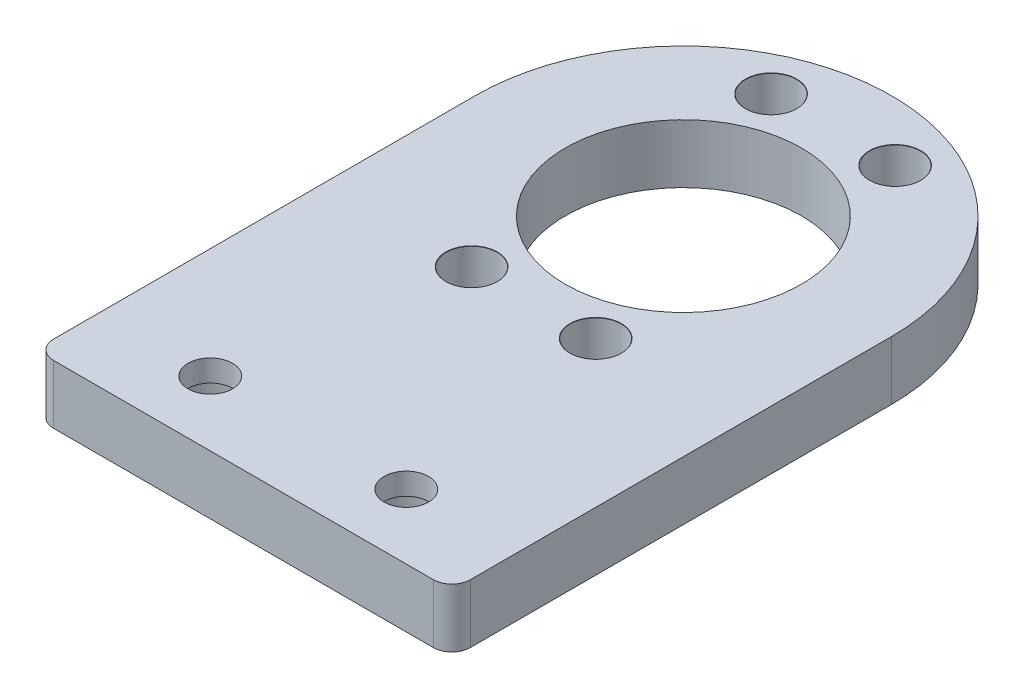
ISO-10303-21;
HEADER;
FILE_DESCRIPTION(('STEP AP214'),'2;1');
FILE_NAME('part.step','',(''),(''),'','','');
FILE_SCHEMA(('AUTOMOTIVE_DESIGN { 1 0 10303 214 1 1 1 1 }'));
ENDSEC;
DATA;
#1=APPLICATION_CONTEXT('core data for automotive mechanical design processes');
#2=APPLICATION_PROTOCOL_DEFINITION('international standard','automotive_design',2000,#1);
#3=PRODUCT_CONTEXT('',#1,'mechanical');
#4=PRODUCT('Part','Part','',(#3));
#5=PRODUCT_RELATED_PRODUCT_CATEGORY('part','',(#4));
#6=PRODUCT_DEFINITION_FORMATION('','',#4);
#7=PRODUCT_DEFINITION_CONTEXT('part definition',#1,'design');
#8=PRODUCT_DEFINITION('design','',#6,#7);
#9=PRODUCT_DEFINITION_SHAPE('','',#8);
#10=(LENGTH_UNIT() NAMED_UNIT(*) SI_UNIT(.MILLI.,.METRE.));
#11=(NAMED_UNIT(*) PLANE_ANGLE_UNIT() SI_UNIT($,.RADIAN.));
#12=(NAMED_UNIT(*) SI_UNIT($,.STERADIAN.) SOLID_ANGLE_UNIT());
#13=UNCERTAINTY_MEASURE_WITH_UNIT(LENGTH_MEASURE(1.E-05),#10,'distance_accuracy_value','');
#14=(GEOMETRIC_REPRESENTATION_CONTEXT(3) GLOBAL_UNCERTAINTY_ASSIGNED_CONTEXT((#13)) GLOBAL_UNIT_ASSIGNED_CONTEXT((#10,
#11,#12)) REPRESENTATION_CONTEXT('',''));
#15=CARTESIAN_POINT('',(0.,0.,0.));
#16=DIRECTION('',(0.,0.,1.));
#17=DIRECTION('',(1.,0.,0.));
#18=AXIS2_PLACEMENT_3D('',#15,#16,#17);
#19=CARTESIAN_POINT('',(0.,6.35,0.));
#20=DIRECTION('',(0.,-1.,0.));
#21=DIRECTION('',(0.,0.,-1.));
#22=AXIS2_PLACEMENT_3D('',#19,#20,#21);
#23=CYLINDRICAL_SURFACE('',#22,22.5);
#24=CARTESIAN_POINT('',(0.,0.,0.));
#25=DIRECTION('',(0.,1.,0.));
#26=DIRECTION('',(0.,0.,1.));
#27=AXIS2_PLACEMENT_3D('',#24,#25,#26);
#28=CIRCLE('',#27,22.5);
#29=CARTESIAN_POINT('',(22.5,0.,-3.34374024839517E-07));
#30=VERTEX_POINT('',#29);
#31=CARTESIAN_POINT('',(-22.5,0.,-3.3437402059358E-07));
#32=VERTEX_POINT('',#31);
#33=EDGE_CURVE('E113',#30,#32,#28,.T.);
#34=ORIENTED_EDGE('',*,*,#33,.T.);
#35=DIRECTION('',(0.,-1.,0.));
#36=VECTOR('',#35,1.);
#37=CARTESIAN_POINT('',(-22.5,6.35,-3.3437402059358E-07));
#38=LINE('',#37,#36);
#39=CARTESIAN_POINT('',(-22.5,6.35,-3.3437402059358E-07));
#40=VERTEX_POINT('',#39);
#41=EDGE_CURVE('E98',#40,#32,#38,.T.);
#42=ORIENTED_EDGE('',*,*,#41,.F.);
#43=CARTESIAN_POINT('',(0.,6.35,0.));
#44=DIRECTION('',(0.,1.,0.));
#45=DIRECTION('',(0.,0.,1.));
#46=AXIS2_PLACEMENT_3D('',#43,#44,#45);
#47=CIRCLE('',#46,22.5);
#48=CARTESIAN_POINT('',(22.5,6.35,-3.34374024839517E-07));
#49=VERTEX_POINT('',#48);
#50=EDGE_CURVE('E102',#49,#40,#47,.T.);
#51=ORIENTED_EDGE('',*,*,#50,.F.);
#52=DIRECTION('',(0.,-1.,0.));
#53=VECTOR('',#52,1.);
#54=CARTESIAN_POINT('',(22.5,6.35,-3.34374024839517E-07));
#55=LINE('',#54,#53);
#56=EDGE_CURVE('E115',#49,#30,#55,.T.);
#57=ORIENTED_EDGE('',*,*,#56,.T.);
#58=EDGE_LOOP('',(#34,#42,#51,#57));
#59=FACE_BOUND('',#58,.T.);
#60=ADVANCED_FACE('F41',(#59),#23,.T.);
#61=CARTESIAN_POINT('',(-22.5,6.35,47.5));
#62=DIRECTION('',(1.,0.,0.));
#63=DIRECTION('',(0.,0.,-1.));
#64=AXIS2_PLACEMENT_3D('',#61,#62,#63);
#65=PLANE('',#64);
#66=DIRECTION('',(0.,0.,1.));
#67=VECTOR('',#66,1.);
#68=CARTESIAN_POINT('',(-22.5,0.,47.5));
#69=LINE('',#68,#67);
#70=CARTESIAN_POINT('',(-22.5,0.,45.5));
#71=VERTEX_POINT('',#70);
#72=EDGE_CURVE('E141',#32,#71,#69,.T.);
#73=ORIENTED_EDGE('',*,*,#72,.T.);
#74=DIRECTION('',(0.,-1.,0.));
#75=VECTOR('',#74,1.);
#76=CARTESIAN_POINT('',(-22.5,6.35,45.5));
#77=LINE('',#76,#75);
#78=CARTESIAN_POINT('',(-22.5,6.35,45.5));
#79=VERTEX_POINT('',#78);
#80=EDGE_CURVE('E64',#71,#79,#77,.F.);
#81=ORIENTED_EDGE('',*,*,#80,.T.);
#82=DIRECTION('',(0.,0.,1.));
#83=VECTOR('',#82,1.);
#84=CARTESIAN_POINT('',(-22.5,6.35,47.5));
#85=LINE('',#84,#83);
#86=EDGE_CURVE('E94',#40,#79,#85,.T.);
#87=ORIENTED_EDGE('',*,*,#86,.F.);
#88=ORIENTED_EDGE('',*,*,#41,.T.);
#89=EDGE_LOOP('',(#73,#81,#87,#88));
#90=FACE_BOUND('',#89,.T.);
#91=ADVANCED_FACE('F96',(#90),#65,.F.);
#92=CARTESIAN_POINT('',(-22.5,6.35,47.5));
#93=DIRECTION('',(0.,0.,-1.));
#94=DIRECTION('',(-1.,0.,0.));
#95=AXIS2_PLACEMENT_3D('',#92,#93,#94);
#96=PLANE('',#95);
#97=DIRECTION('',(1.,0.,0.));
#98=VECTOR('',#97,1.);
#99=CARTESIAN_POINT('',(-22.5,6.35,47.5));
#100=LINE('',#99,#98);
#101=CARTESIAN_POINT('',(-20.5,6.35,47.5));
#102=VERTEX_POINT('',#101);
#103=CARTESIAN_POINT('',(20.5,6.35,47.5));
#104=VERTEX_POINT('',#103);
#105=EDGE_CURVE('E101',#102,#104,#100,.T.);
#106=ORIENTED_EDGE('',*,*,#105,.F.);
#107=DIRECTION('',(0.,-1.,0.));
#108=VECTOR('',#107,1.);
#109=CARTESIAN_POINT('',(-20.5,6.35,47.5));
#110=LINE('',#109,#108);
#111=CARTESIAN_POINT('',(-20.5,0.,47.5));
#112=VERTEX_POINT('',#111);
#113=EDGE_CURVE('E117',#102,#112,#110,.T.);
#114=ORIENTED_EDGE('',*,*,#113,.T.);
#115=DIRECTION('',(1.,0.,0.));
#116=VECTOR('',#115,1.);
#117=CARTESIAN_POINT('',(-22.5,0.,47.5));
#118=LINE('',#117,#116);
#119=CARTESIAN_POINT('',(20.5,0.,47.5));
#120=VERTEX_POINT('',#119);
#121=EDGE_CURVE('E142',#112,#120,#118,.T.);
#122=ORIENTED_EDGE('',*,*,#121,.T.);
#123=DIRECTION('',(0.,-1.,0.));
#124=VECTOR('',#123,1.);
#125=CARTESIAN_POINT('',(20.5,6.35,47.5));
#126=LINE('',#125,#124);
#127=EDGE_CURVE('E114',#120,#104,#126,.F.);
#128=ORIENTED_EDGE('',*,*,#127,.T.);
#129=EDGE_LOOP('',(#106,#114,#122,#128));
#130=FACE_BOUND('',#129,.T.);
#131=ADVANCED_FACE('F133',(#130),#96,.F.);
#132=CARTESIAN_POINT('',(22.5,6.35,47.5));
#133=DIRECTION('',(-1.,0.,0.));
#134=DIRECTION('',(0.,0.,1.));
#135=AXIS2_PLACEMENT_3D('',#132,#133,#134);
#136=PLANE('',#135);
#137=DIRECTION('',(0.,0.,-1.));
#138=VECTOR('',#137,1.);
#139=CARTESIAN_POINT('',(22.5,6.35,47.5));
#140=LINE('',#139,#138);
#141=CARTESIAN_POINT('',(22.5,6.35,45.5));
#142=VERTEX_POINT('',#141);
#143=EDGE_CURVE('E106',#142,#49,#140,.T.);
#144=ORIENTED_EDGE('',*,*,#143,.F.);
#145=DIRECTION('',(0.,-1.,0.));
#146=VECTOR('',#145,1.);
#147=CARTESIAN_POINT('',(22.5,6.35,45.5));
#148=LINE('',#147,#146);
#149=CARTESIAN_POINT('',(22.5,0.,45.5));
#150=VERTEX_POINT('',#149);
#151=EDGE_CURVE('E11',#142,#150,#148,.T.);
#152=ORIENTED_EDGE('',*,*,#151,.T.);
#153=DIRECTION('',(0.,0.,-1.));
#154=VECTOR('',#153,1.);
#155=CARTESIAN_POINT('',(22.5,0.,47.5));
#156=LINE('',#155,#154);
#157=EDGE_CURVE('E110',#150,#30,#156,.T.);
#158=ORIENTED_EDGE('',*,*,#157,.T.);
#159=ORIENTED_EDGE('',*,*,#56,.F.);
#160=EDGE_LOOP('',(#144,#152,#158,#159));
#161=FACE_BOUND('',#160,.T.);
#162=ADVANCED_FACE('F150',(#161),#136,.F.);
#163=CARTESIAN_POINT('',(0.,6.35,0.));
#164=DIRECTION('',(0.,1.,0.));
#165=DIRECTION('',(0.,0.,1.));
#166=AXIS2_PLACEMENT_3D('',#163,#164,#165);
#167=PLANE('',#166);
#168=CARTESIAN_POINT('',(10.5847856494314,6.35,40.5));
#169=DIRECTION('',(0.,-1.,0.));
#170=DIRECTION('',(0.,0.,-1.));
#171=AXIS2_PLACEMENT_3D('',#168,#169,#170);
#172=CIRCLE('',#171,2.4);
#173=CARTESIAN_POINT('',(10.5847856494314,6.35,38.1));
#174=VERTEX_POINT('',#173);
#175=EDGE_CURVE('E259',#174,#174,#172,.T.);
#176=ORIENTED_EDGE('',*,*,#175,.T.);
#177=EDGE_LOOP('',(#176));
#178=FACE_BOUND('',#177,.T.);
#179=CARTESIAN_POINT('',(-10.5847856494314,6.35,40.5));
#180=DIRECTION('',(0.,-1.,0.));
#181=DIRECTION('',(0.,0.,-1.));
#182=AXIS2_PLACEMENT_3D('',#179,#180,#181);
#183=CIRCLE('',#182,2.4);
#184=CARTESIAN_POINT('',(-10.5847856494314,6.35,38.1));
#185=VERTEX_POINT('',#184);
#186=EDGE_CURVE('E274',#185,#185,#183,.T.);
#187=ORIENTED_EDGE('',*,*,#186,.T.);
#188=EDGE_LOOP('',(#187));
#189=FACE_BOUND('',#188,.T.);
#190=CARTESIAN_POINT('',(0.,6.35,0.));
#191=DIRECTION('',(0.,1.,0.));
#192=DIRECTION('',(0.,0.,1.));
#193=AXIS2_PLACEMENT_3D('',#190,#191,#192);
#194=CIRCLE('',#193,12.75);
#195=CARTESIAN_POINT('',(0.,6.35,12.75));
#196=VERTEX_POINT('',#195);
#197=EDGE_CURVE('E277',#196,#196,#194,.T.);
#198=ORIENTED_EDGE('',*,*,#197,.F.);
#199=EDGE_LOOP('',(#198));
#200=FACE_BOUND('',#199,.T.);
#201=CARTESIAN_POINT('',(-6.69696006638907,6.35,16.1678918189475));
#202=DIRECTION('',(0.,1.,0.));
#203=DIRECTION('',(0.,0.,1.));
#204=AXIS2_PLACEMENT_3D('',#201,#202,#203);
#205=CIRCLE('',#204,2.775);
#206=CARTESIAN_POINT('',(-6.69696006638907,6.35,18.9428918189475));
#207=VERTEX_POINT('',#206);
#208=EDGE_CURVE('E281',#207,#207,#205,.T.);
#209=ORIENTED_EDGE('',*,*,#208,.F.);
#210=EDGE_LOOP('',(#209));
#211=FACE_BOUND('',#210,.T.);
#212=CARTESIAN_POINT('',(6.69696006638907,6.35,16.1678918189475));
#213=DIRECTION('',(0.,1.,0.));
#214=DIRECTION('',(0.,0.,1.));
#215=AXIS2_PLACEMENT_3D('',#212,#213,#214);
#216=CIRCLE('',#215,2.775);
#217=CARTESIAN_POINT('',(6.69696006638907,6.35,18.9428918189475));
#218=VERTEX_POINT('',#217);
#219=EDGE_CURVE('E292',#218,#218,#216,.T.);
#220=ORIENTED_EDGE('',*,*,#219,.F.);
#221=EDGE_LOOP('',(#220));
#222=FACE_BOUND('',#221,.T.);
#223=CARTESIAN_POINT('',(6.69696006638907,6.35,-16.1678918189475));
#224=DIRECTION('',(0.,1.,0.));
#225=DIRECTION('',(0.,0.,1.));
#226=AXIS2_PLACEMENT_3D('',#223,#224,#225);
#227=CIRCLE('',#226,2.775);
#228=CARTESIAN_POINT('',(6.69696006638907,6.35,-13.3928918189475));
#229=VERTEX_POINT('',#228);
#230=EDGE_CURVE('E301',#229,#229,#227,.T.);
#231=ORIENTED_EDGE('',*,*,#230,.F.);
#232=EDGE_LOOP('',(#231));
#233=FACE_BOUND('',#232,.T.);
#234=CARTESIAN_POINT('',(-6.69696006638907,6.35,-16.1678918189475));
#235=DIRECTION('',(0.,1.,0.));
#236=DIRECTION('',(0.,0.,1.));
#237=AXIS2_PLACEMENT_3D('',#234,#235,#236);
#238=CIRCLE('',#237,2.775);
#239=CARTESIAN_POINT('',(-6.69696006638907,6.35,-13.3928918189475));
#240=VERTEX_POINT('',#239);
#241=EDGE_CURVE('E310',#240,#240,#238,.T.);
#242=ORIENTED_EDGE('',*,*,#241,.F.);
#243=EDGE_LOOP('',(#242));
#244=FACE_BOUND('',#243,.T.);
#245=ORIENTED_EDGE('',*,*,#86,.T.);
#246=CARTESIAN_POINT('',(-20.5,6.35,45.5));
#247=DIRECTION('',(0.,1.,0.));
#248=DIRECTION('',(0.,0.,1.));
#249=AXIS2_PLACEMENT_3D('',#246,#247,#248);
#250=CIRCLE('',#249,2.);
#251=EDGE_CURVE('E49',#79,#102,#250,.T.);
#252=ORIENTED_EDGE('',*,*,#251,.T.);
#253=ORIENTED_EDGE('',*,*,#105,.T.);
#254=CARTESIAN_POINT('',(20.5,6.35,45.5));
#255=DIRECTION('',(0.,1.,0.));
#256=DIRECTION('',(0.,0.,1.));
#257=AXIS2_PLACEMENT_3D('',#254,#255,#256);
#258=CIRCLE('',#257,2.);
#259=EDGE_CURVE('E56',#104,#142,#258,.T.);
#260=ORIENTED_EDGE('',*,*,#259,.T.);
#261=ORIENTED_EDGE('',*,*,#143,.T.);
#262=ORIENTED_EDGE('',*,*,#50,.T.);
#263=EDGE_LOOP('',(#245,#252,#253,#260,#261,#262));
#264=FACE_BOUND('',#263,.T.);
#265=ADVANCED_FACE('F105',(#178,#189,#200,#211,#222,#233,#244,#264),#167,.T.);
#266=CARTESIAN_POINT('',(0.,0.,0.));
#267=DIRECTION('',(0.,1.,0.));
#268=DIRECTION('',(0.,0.,1.));
#269=AXIS2_PLACEMENT_3D('',#266,#267,#268);
#270=PLANE('',#269);
#271=CARTESIAN_POINT('',(10.5847856494314,0.,40.5));
#272=DIRECTION('',(0.,-1.,0.));
#273=DIRECTION('',(0.,0.,-1.));
#274=AXIS2_PLACEMENT_3D('',#271,#272,#273);
#275=CIRCLE('',#274,4.025);
#276=CARTESIAN_POINT('',(10.5847856494314,0.,36.475));
#277=VERTEX_POINT('',#276);
#278=EDGE_CURVE('E249',#277,#277,#275,.T.);
#279=ORIENTED_EDGE('',*,*,#278,.F.);
#280=EDGE_LOOP('',(#279));
#281=FACE_BOUND('',#280,.T.);
#282=CARTESIAN_POINT('',(-10.5847856494314,0.,40.5));
#283=DIRECTION('',(0.,-1.,0.));
#284=DIRECTION('',(0.,0.,-1.));
#285=AXIS2_PLACEMENT_3D('',#282,#283,#284);
#286=CIRCLE('',#285,4.025);
#287=CARTESIAN_POINT('',(-10.5847856494314,0.,36.475));
#288=VERTEX_POINT('',#287);
#289=EDGE_CURVE('E262',#288,#288,#286,.T.);
#290=ORIENTED_EDGE('',*,*,#289,.F.);
#291=EDGE_LOOP('',(#290));
#292=FACE_BOUND('',#291,.T.);
#293=CARTESIAN_POINT('',(0.,0.,0.));
#294=DIRECTION('',(0.,1.,0.));
#295=DIRECTION('',(0.,0.,1.));
#296=AXIS2_PLACEMENT_3D('',#293,#294,#295);
#297=CIRCLE('',#296,12.75);
#298=CARTESIAN_POINT('',(0.,0.,12.75));
#299=VERTEX_POINT('',#298);
#300=EDGE_CURVE('E278',#299,#299,#297,.T.);
#301=ORIENTED_EDGE('',*,*,#300,.T.);
#302=EDGE_LOOP('',(#301));
#303=FACE_BOUND('',#302,.T.);
#304=CARTESIAN_POINT('',(-6.69696006638907,0.,16.1678918189475));
#305=DIRECTION('',(0.,1.,0.));
#306=DIRECTION('',(0.,0.,1.));
#307=AXIS2_PLACEMENT_3D('',#304,#305,#306);
#308=CIRCLE('',#307,2.75);
#309=CARTESIAN_POINT('',(-6.69696006638907,0.,18.9178918189475));
#310=VERTEX_POINT('',#309);
#311=EDGE_CURVE('E289',#310,#310,#308,.T.);
#312=ORIENTED_EDGE('',*,*,#311,.T.);
#313=EDGE_LOOP('',(#312));
#314=FACE_BOUND('',#313,.T.);
#315=CARTESIAN_POINT('',(6.69696006638907,0.,16.1678918189475));
#316=DIRECTION('',(0.,1.,0.));
#317=DIRECTION('',(0.,0.,1.));
#318=AXIS2_PLACEMENT_3D('',#315,#316,#317);
#319=CIRCLE('',#318,2.75);
#320=CARTESIAN_POINT('',(6.69696006638907,0.,18.9178918189475));
#321=VERTEX_POINT('',#320);
#322=EDGE_CURVE('E298',#321,#321,#319,.T.);
#323=ORIENTED_EDGE('',*,*,#322,.T.);
#324=EDGE_LOOP('',(#323));
#325=FACE_BOUND('',#324,.T.);
#326=CARTESIAN_POINT('',(6.69696006638907,0.,-16.1678918189475));
#327=DIRECTION('',(0.,1.,0.));
#328=DIRECTION('',(0.,0.,1.));
#329=AXIS2_PLACEMENT_3D('',#326,#327,#328);
#330=CIRCLE('',#329,2.75);
#331=CARTESIAN_POINT('',(6.69696006638907,0.,-13.4178918189475));
#332=VERTEX_POINT('',#331);
#333=EDGE_CURVE('E307',#332,#332,#330,.T.);
#334=ORIENTED_EDGE('',*,*,#333,.T.);
#335=EDGE_LOOP('',(#334));
#336=FACE_BOUND('',#335,.T.);
#337=CARTESIAN_POINT('',(-6.69696006638907,0.,-16.1678918189475));
#338=DIRECTION('',(0.,1.,0.));
#339=DIRECTION('',(0.,0.,1.));
#340=AXIS2_PLACEMENT_3D('',#337,#338,#339);
#341=CIRCLE('',#340,2.75);
#342=CARTESIAN_POINT('',(-6.69696006638907,0.,-13.4178918189475));
#343=VERTEX_POINT('',#342);
#344=EDGE_CURVE('E145',#343,#343,#341,.T.);
#345=ORIENTED_EDGE('',*,*,#344,.T.);
#346=EDGE_LOOP('',(#345));
#347=FACE_BOUND('',#346,.T.);
#348=ORIENTED_EDGE('',*,*,#121,.F.);
#349=CARTESIAN_POINT('',(-20.5,0.,45.5));
#350=DIRECTION('',(0.,1.,0.));
#351=DIRECTION('',(0.,0.,1.));
#352=AXIS2_PLACEMENT_3D('',#349,#350,#351);
#353=CIRCLE('',#352,2.);
#354=EDGE_CURVE('E126',#112,#71,#353,.F.);
#355=ORIENTED_EDGE('',*,*,#354,.T.);
#356=ORIENTED_EDGE('',*,*,#72,.F.);
#357=ORIENTED_EDGE('',*,*,#33,.F.);
#358=ORIENTED_EDGE('',*,*,#157,.F.);
#359=CARTESIAN_POINT('',(20.5,0.,45.5));
#360=DIRECTION('',(0.,1.,0.));
#361=DIRECTION('',(0.,0.,1.));
#362=AXIS2_PLACEMENT_3D('',#359,#360,#361);
#363=CIRCLE('',#362,2.);
#364=EDGE_CURVE('E124',#150,#120,#363,.F.);
#365=ORIENTED_EDGE('',*,*,#364,.T.);
#366=EDGE_LOOP('',(#348,#355,#356,#357,#358,#365));
#367=FACE_BOUND('',#366,.T.);
#368=ADVANCED_FACE('F140',(#281,#292,#303,#314,#325,#336,#347,#367),#270,.F.);
#369=CARTESIAN_POINT('',(-6.69696006638907,6.35,-16.1678918189475));
#370=DIRECTION('',(0.,1.,0.));
#371=DIRECTION('',(0.,0.,1.));
#372=AXIS2_PLACEMENT_3D('',#369,#370,#371);
#373=CYLINDRICAL_SURFACE('',#372,2.75);
#374=ORIENTED_EDGE('',*,*,#344,.F.);
#375=EDGE_LOOP('',(#374));
#376=FACE_BOUND('',#375,.T.);
#377=CARTESIAN_POINT('',(-6.69696006638907,6.325,-16.1678918189475));
#378=DIRECTION('',(0.,1.,0.));
#379=DIRECTION('',(0.,0.,1.));
#380=AXIS2_PLACEMENT_3D('',#377,#378,#379);
#381=CIRCLE('',#380,2.75);
#382=CARTESIAN_POINT('',(-6.69696006638907,6.325,-13.4178918189475));
#383=VERTEX_POINT('',#382);
#384=EDGE_CURVE('E313',#383,#383,#381,.T.);
#385=ORIENTED_EDGE('',*,*,#384,.T.);
#386=EDGE_LOOP('',(#385));
#387=FACE_BOUND('',#386,.T.);
#388=ADVANCED_FACE('F171',(#376,#387),#373,.F.);
#389=CARTESIAN_POINT('',(-6.69696006638907,6.35,-16.1678918189475));
#390=DIRECTION('',(0.,1.,0.));
#391=DIRECTION('',(0.,0.,1.));
#392=AXIS2_PLACEMENT_3D('',#389,#390,#391);
#393=CONICAL_SURFACE('',#392,2.775,0.785398163397414);
#394=ORIENTED_EDGE('',*,*,#384,.F.);
#395=EDGE_LOOP('',(#394));
#396=FACE_BOUND('',#395,.T.);
#397=ORIENTED_EDGE('',*,*,#241,.T.);
#398=EDGE_LOOP('',(#397));
#399=FACE_BOUND('',#398,.T.);
#400=ADVANCED_FACE('F178',(#396,#399),#393,.F.);
#401=CARTESIAN_POINT('',(6.69696006638907,6.35,-16.1678918189475));
#402=DIRECTION('',(0.,1.,0.));
#403=DIRECTION('',(0.,0.,1.));
#404=AXIS2_PLACEMENT_3D('',#401,#402,#403);
#405=CYLINDRICAL_SURFACE('',#404,2.75);
#406=ORIENTED_EDGE('',*,*,#333,.F.);
#407=EDGE_LOOP('',(#406));
#408=FACE_BOUND('',#407,.T.);
#409=CARTESIAN_POINT('',(6.69696006638907,6.325,-16.1678918189475));
#410=DIRECTION('',(0.,1.,0.));
#411=DIRECTION('',(0.,0.,1.));
#412=AXIS2_PLACEMENT_3D('',#409,#410,#411);
#413=CIRCLE('',#412,2.75);
#414=CARTESIAN_POINT('',(6.69696006638907,6.325,-13.4178918189475));
#415=VERTEX_POINT('',#414);
#416=EDGE_CURVE('E304',#415,#415,#413,.T.);
#417=ORIENTED_EDGE('',*,*,#416,.T.);
#418=EDGE_LOOP('',(#417));
#419=FACE_BOUND('',#418,.T.);
#420=ADVANCED_FACE('F182',(#408,#419),#405,.F.);
#421=CARTESIAN_POINT('',(6.69696006638907,6.35,-16.1678918189475));
#422=DIRECTION('',(0.,1.,0.));
#423=DIRECTION('',(0.,0.,1.));
#424=AXIS2_PLACEMENT_3D('',#421,#422,#423);
#425=CONICAL_SURFACE('',#424,2.775,0.785398163397414);
#426=ORIENTED_EDGE('',*,*,#416,.F.);
#427=EDGE_LOOP('',(#426));
#428=FACE_BOUND('',#427,.T.);
#429=ORIENTED_EDGE('',*,*,#230,.T.);
#430=EDGE_LOOP('',(#429));
#431=FACE_BOUND('',#430,.T.);
#432=ADVANCED_FACE('F186',(#428,#431),#425,.F.);
#433=CARTESIAN_POINT('',(6.69696006638907,6.35,16.1678918189475));
#434=DIRECTION('',(0.,1.,0.));
#435=DIRECTION('',(0.,0.,1.));
#436=AXIS2_PLACEMENT_3D('',#433,#434,#435);
#437=CYLINDRICAL_SURFACE('',#436,2.75);
#438=ORIENTED_EDGE('',*,*,#322,.F.);
#439=EDGE_LOOP('',(#438));
#440=FACE_BOUND('',#439,.T.);
#441=CARTESIAN_POINT('',(6.69696006638907,6.325,16.1678918189475));
#442=DIRECTION('',(0.,1.,0.));
#443=DIRECTION('',(0.,0.,1.));
#444=AXIS2_PLACEMENT_3D('',#441,#442,#443);
#445=CIRCLE('',#444,2.75);
#446=CARTESIAN_POINT('',(6.69696006638907,6.325,18.9178918189475));
#447=VERTEX_POINT('',#446);
#448=EDGE_CURVE('E295',#447,#447,#445,.T.);
#449=ORIENTED_EDGE('',*,*,#448,.T.);
#450=EDGE_LOOP('',(#449));
#451=FACE_BOUND('',#450,.T.);
#452=ADVANCED_FACE('F190',(#440,#451),#437,.F.);
#453=CARTESIAN_POINT('',(6.69696006638907,6.35,16.1678918189475));
#454=DIRECTION('',(0.,1.,0.));
#455=DIRECTION('',(0.,0.,1.));
#456=AXIS2_PLACEMENT_3D('',#453,#454,#455);
#457=CONICAL_SURFACE('',#456,2.775,0.785398163397414);
#458=ORIENTED_EDGE('',*,*,#448,.F.);
#459=EDGE_LOOP('',(#458));
#460=FACE_BOUND('',#459,.T.);
#461=ORIENTED_EDGE('',*,*,#219,.T.);
#462=EDGE_LOOP('',(#461));
#463=FACE_BOUND('',#462,.T.);
#464=ADVANCED_FACE('F194',(#460,#463),#457,.F.);
#465=CARTESIAN_POINT('',(-6.69696006638907,6.35,16.1678918189475));
#466=DIRECTION('',(0.,1.,0.));
#467=DIRECTION('',(0.,0.,1.));
#468=AXIS2_PLACEMENT_3D('',#465,#466,#467);
#469=CYLINDRICAL_SURFACE('',#468,2.75);
#470=ORIENTED_EDGE('',*,*,#311,.F.);
#471=EDGE_LOOP('',(#470));
#472=FACE_BOUND('',#471,.T.);
#473=CARTESIAN_POINT('',(-6.69696006638907,6.325,16.1678918189475));
#474=DIRECTION('',(0.,1.,0.));
#475=DIRECTION('',(0.,0.,1.));
#476=AXIS2_PLACEMENT_3D('',#473,#474,#475);
#477=CIRCLE('',#476,2.75);
#478=CARTESIAN_POINT('',(-6.69696006638907,6.325,18.9178918189475));
#479=VERTEX_POINT('',#478);
#480=EDGE_CURVE('E286',#479,#479,#477,.T.);
#481=ORIENTED_EDGE('',*,*,#480,.T.);
#482=EDGE_LOOP('',(#481));
#483=FACE_BOUND('',#482,.T.);
#484=ADVANCED_FACE('F198',(#472,#483),#469,.F.);
#485=CARTESIAN_POINT('',(-6.69696006638907,6.35,16.1678918189475));
#486=DIRECTION('',(0.,1.,0.));
#487=DIRECTION('',(0.,0.,1.));
#488=AXIS2_PLACEMENT_3D('',#485,#486,#487);
#489=CONICAL_SURFACE('',#488,2.775,0.785398163397414);
#490=ORIENTED_EDGE('',*,*,#480,.F.);
#491=EDGE_LOOP('',(#490));
#492=FACE_BOUND('',#491,.T.);
#493=ORIENTED_EDGE('',*,*,#208,.T.);
#494=EDGE_LOOP('',(#493));
#495=FACE_BOUND('',#494,.T.);
#496=ADVANCED_FACE('F202',(#492,#495),#489,.F.);
#497=CARTESIAN_POINT('',(0.,0.,0.));
#498=DIRECTION('',(0.,1.,0.));
#499=DIRECTION('',(0.,0.,1.));
#500=AXIS2_PLACEMENT_3D('',#497,#498,#499);
#501=CYLINDRICAL_SURFACE('',#500,12.75);
#502=ORIENTED_EDGE('',*,*,#300,.F.);
#503=EDGE_LOOP('',(#502));
#504=FACE_BOUND('',#503,.T.);
#505=ORIENTED_EDGE('',*,*,#197,.T.);
#506=EDGE_LOOP('',(#505));
#507=FACE_BOUND('',#506,.T.);
#508=ADVANCED_FACE('F206',(#504,#507),#501,.F.);
#509=CARTESIAN_POINT('',(-10.5847856494314,0.,40.5));
#510=DIRECTION('',(0.,-1.,0.));
#511=DIRECTION('',(0.,0.,-1.));
#512=AXIS2_PLACEMENT_3D('',#509,#510,#511);
#513=CYLINDRICAL_SURFACE('',#512,2.4);
#514=ORIENTED_EDGE('',*,*,#186,.F.);
#515=EDGE_LOOP('',(#514));
#516=FACE_BOUND('',#515,.T.);
#517=CARTESIAN_POINT('',(-10.5847856494314,4.,40.5));
#518=DIRECTION('',(0.,-1.,0.));
#519=DIRECTION('',(0.,0.,-1.));
#520=AXIS2_PLACEMENT_3D('',#517,#518,#519);
#521=CIRCLE('',#520,2.4);
#522=CARTESIAN_POINT('',(-10.5847856494314,4.,38.1));
#523=VERTEX_POINT('',#522);
#524=EDGE_CURVE('E271',#523,#523,#521,.T.);
#525=ORIENTED_EDGE('',*,*,#524,.T.);
#526=EDGE_LOOP('',(#525));
#527=FACE_BOUND('',#526,.T.);
#528=ADVANCED_FACE('F210',(#516,#527),#513,.F.);
#529=CARTESIAN_POINT('',(-6.58478564943144,4.,40.5));
#530=DIRECTION('',(0.,1.,0.));
#531=DIRECTION('',(0.,0.,1.));
#532=AXIS2_PLACEMENT_3D('',#529,#530,#531);
#533=PLANE('',#532);
#534=ORIENTED_EDGE('',*,*,#524,.F.);
#535=EDGE_LOOP('',(#534));
#536=FACE_BOUND('',#535,.T.);
#537=CARTESIAN_POINT('',(-10.5847856494314,4.,40.5));
#538=DIRECTION('',(0.,-1.,0.));
#539=DIRECTION('',(0.,0.,-1.));
#540=AXIS2_PLACEMENT_3D('',#537,#538,#539);
#541=CIRCLE('',#540,4.);
#542=CARTESIAN_POINT('',(-10.5847856494314,4.,36.5));
#543=VERTEX_POINT('',#542);
#544=EDGE_CURVE('E268',#543,#543,#541,.T.);
#545=ORIENTED_EDGE('',*,*,#544,.T.);
#546=EDGE_LOOP('',(#545));
#547=FACE_BOUND('',#546,.T.);
#548=ADVANCED_FACE('F214',(#536,#547),#533,.F.);
#549=CARTESIAN_POINT('',(-10.5847856494314,0.,40.5));
#550=DIRECTION('',(0.,-1.,0.));
#551=DIRECTION('',(0.,0.,-1.));
#552=AXIS2_PLACEMENT_3D('',#549,#550,#551);
#553=CYLINDRICAL_SURFACE('',#552,4.);
#554=ORIENTED_EDGE('',*,*,#544,.F.);
#555=EDGE_LOOP('',(#554));
#556=FACE_BOUND('',#555,.T.);
#557=CARTESIAN_POINT('',(-10.5847856494314,0.0250000000000018,40.5));
#558=DIRECTION('',(0.,-1.,0.));
#559=DIRECTION('',(0.,0.,-1.));
#560=AXIS2_PLACEMENT_3D('',#557,#558,#559);
#561=CIRCLE('',#560,4.);
#562=CARTESIAN_POINT('',(-10.5847856494314,0.0250000000000018,36.5));
#563=VERTEX_POINT('',#562);
#564=EDGE_CURVE('E265',#563,#563,#561,.T.);
#565=ORIENTED_EDGE('',*,*,#564,.T.);
#566=EDGE_LOOP('',(#565));
#567=FACE_BOUND('',#566,.T.);
#568=ADVANCED_FACE('F218',(#556,#567),#553,.F.);
#569=CARTESIAN_POINT('',(-10.5847856494314,0.,40.5));
#570=DIRECTION('',(0.,-1.,0.));
#571=DIRECTION('',(0.,0.,-1.));
#572=AXIS2_PLACEMENT_3D('',#569,#570,#571);
#573=CONICAL_SURFACE('',#572,4.025,0.785398163397444);
#574=ORIENTED_EDGE('',*,*,#564,.F.);
#575=EDGE_LOOP('',(#574));
#576=FACE_BOUND('',#575,.T.);
#577=ORIENTED_EDGE('',*,*,#289,.T.);
#578=EDGE_LOOP('',(#577));
#579=FACE_BOUND('',#578,.T.);
#580=ADVANCED_FACE('F222',(#576,#579),#573,.F.);
#581=CARTESIAN_POINT('',(10.5847856494314,0.,40.5));
#582=DIRECTION('',(0.,-1.,0.));
#583=DIRECTION('',(0.,0.,-1.));
#584=AXIS2_PLACEMENT_3D('',#581,#582,#583);
#585=CYLINDRICAL_SURFACE('',#584,2.4);
#586=ORIENTED_EDGE('',*,*,#175,.F.);
#587=EDGE_LOOP('',(#586));
#588=FACE_BOUND('',#587,.T.);
#589=CARTESIAN_POINT('',(10.5847856494314,4.,40.5));
#590=DIRECTION('',(0.,-1.,0.));
#591=DIRECTION('',(0.,0.,-1.));
#592=AXIS2_PLACEMENT_3D('',#589,#590,#591);
#593=CIRCLE('',#592,2.4);
#594=CARTESIAN_POINT('',(10.5847856494314,4.,38.1));
#595=VERTEX_POINT('',#594);
#596=EDGE_CURVE('E256',#595,#595,#593,.T.);
#597=ORIENTED_EDGE('',*,*,#596,.T.);
#598=EDGE_LOOP('',(#597));
#599=FACE_BOUND('',#598,.T.);
#600=ADVANCED_FACE('F226',(#588,#599),#585,.F.);
#601=CARTESIAN_POINT('',(14.5847856494314,4.,40.5));
#602=DIRECTION('',(0.,1.,0.));
#603=DIRECTION('',(0.,0.,1.));
#604=AXIS2_PLACEMENT_3D('',#601,#602,#603);
#605=PLANE('',#604);
#606=ORIENTED_EDGE('',*,*,#596,.F.);
#607=EDGE_LOOP('',(#606));
#608=FACE_BOUND('',#607,.T.);
#609=CARTESIAN_POINT('',(10.5847856494314,4.,40.5));
#610=DIRECTION('',(0.,-1.,0.));
#611=DIRECTION('',(0.,0.,-1.));
#612=AXIS2_PLACEMENT_3D('',#609,#610,#611);
#613=CIRCLE('',#612,4.);
#614=CARTESIAN_POINT('',(10.5847856494314,4.,36.5));
#615=VERTEX_POINT('',#614);
#616=EDGE_CURVE('E251',#615,#615,#613,.T.);
#617=ORIENTED_EDGE('',*,*,#616,.T.);
#618=EDGE_LOOP('',(#617));
#619=FACE_BOUND('',#618,.T.);
#620=ADVANCED_FACE('F230',(#608,#619),#605,.F.);
#621=CARTESIAN_POINT('',(10.5847856494314,0.,40.5));
#622=DIRECTION('',(0.,-1.,0.));
#623=DIRECTION('',(0.,0.,-1.));
#624=AXIS2_PLACEMENT_3D('',#621,#622,#623);
#625=CYLINDRICAL_SURFACE('',#624,4.);
#626=ORIENTED_EDGE('',*,*,#616,.F.);
#627=EDGE_LOOP('',(#626));
#628=FACE_BOUND('',#627,.T.);
#629=CARTESIAN_POINT('',(10.5847856494314,0.0250000000000018,40.5));
#630=DIRECTION('',(0.,-1.,0.));
#631=DIRECTION('',(0.,0.,-1.));
#632=AXIS2_PLACEMENT_3D('',#629,#630,#631);
#633=CIRCLE('',#632,4.);
#634=CARTESIAN_POINT('',(10.5847856494314,0.0250000000000018,36.5));
#635=VERTEX_POINT('',#634);
#636=EDGE_CURVE('E246',#635,#635,#633,.T.);
#637=ORIENTED_EDGE('',*,*,#636,.T.);
#638=EDGE_LOOP('',(#637));
#639=FACE_BOUND('',#638,.T.);
#640=ADVANCED_FACE('F234',(#628,#639),#625,.F.);
#641=CARTESIAN_POINT('',(10.5847856494314,0.,40.5));
#642=DIRECTION('',(0.,-1.,0.));
#643=DIRECTION('',(0.,0.,-1.));
#644=AXIS2_PLACEMENT_3D('',#641,#642,#643);
#645=CONICAL_SURFACE('',#644,4.025,0.785398163397461);
#646=ORIENTED_EDGE('',*,*,#636,.F.);
#647=EDGE_LOOP('',(#646));
#648=FACE_BOUND('',#647,.T.);
#649=ORIENTED_EDGE('',*,*,#278,.T.);
#650=EDGE_LOOP('',(#649));
#651=FACE_BOUND('',#650,.T.);
#652=ADVANCED_FACE('F157',(#648,#651),#645,.F.);
#653=CARTESIAN_POINT('',(-20.5,6.35,45.5));
#654=DIRECTION('',(0.,-1.,0.));
#655=DIRECTION('',(0.,0.,-1.));
#656=AXIS2_PLACEMENT_3D('',#653,#654,#655);
#657=CYLINDRICAL_SURFACE('',#656,2.);
#658=ORIENTED_EDGE('',*,*,#251,.F.);
#659=ORIENTED_EDGE('',*,*,#80,.F.);
#660=ORIENTED_EDGE('',*,*,#354,.F.);
#661=ORIENTED_EDGE('',*,*,#113,.F.);
#662=EDGE_LOOP('',(#658,#659,#660,#661));
#663=FACE_BOUND('',#662,.T.);
#664=ADVANCED_FACE('F138',(#663),#657,.T.);
#665=CARTESIAN_POINT('',(20.5,6.35,45.5));
#666=DIRECTION('',(0.,-1.,0.));
#667=DIRECTION('',(0.,0.,-1.));
#668=AXIS2_PLACEMENT_3D('',#665,#666,#667);
#669=CYLINDRICAL_SURFACE('',#668,2.);
#670=ORIENTED_EDGE('',*,*,#259,.F.);
#671=ORIENTED_EDGE('',*,*,#127,.F.);
#672=ORIENTED_EDGE('',*,*,#364,.F.);
#673=ORIENTED_EDGE('',*,*,#151,.F.);
#674=EDGE_LOOP('',(#670,#671,#672,#673));
#675=FACE_BOUND('',#674,.T.);
#676=ADVANCED_FACE('F43',(#675),#669,.T.);
#677=CLOSED_SHELL('',(#60,#91,#131,#162,#265,#368,#388,#400,#420,#432,#452,#464,#484,#496,#508,
#528,#548,#568,#580,#600,#620,#640,#652,#664,#676));
#678=MANIFOLD_SOLID_BREP('B2',#677);
#679=ADVANCED_BREP_SHAPE_REPRESENTATION('',(#18,#678),#14);
#680=SHAPE_DEFINITION_REPRESENTATION(#9,#679);
ENDSEC;
END-ISO-10303-21;
